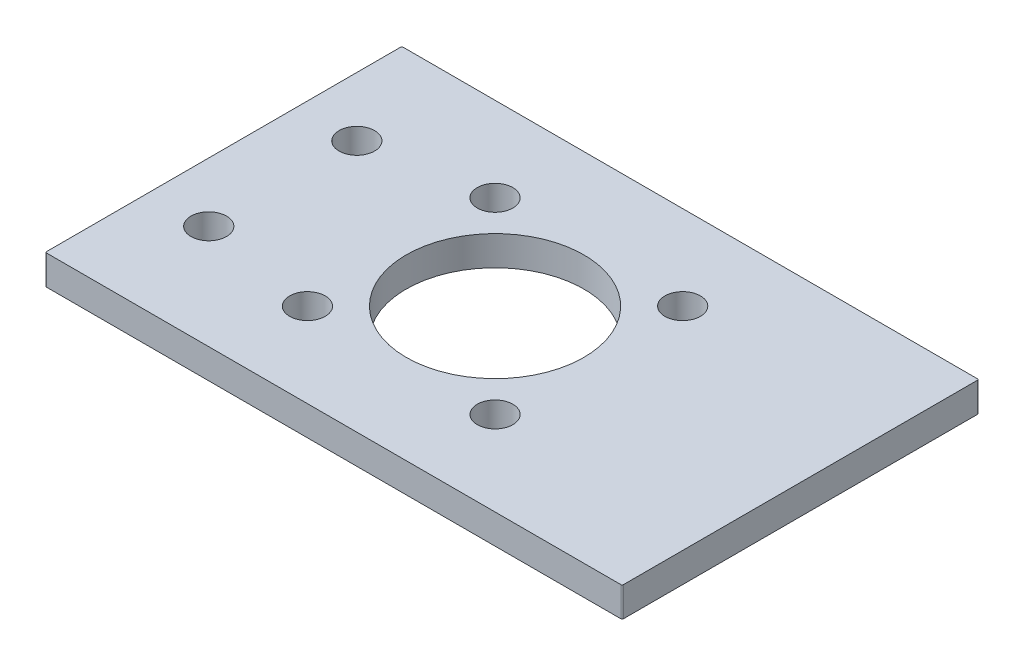
ISO-10303-21;
HEADER;
FILE_DESCRIPTION(('STEP AP214'),'2;1');
FILE_NAME('part.step','',(''),(''),'','','');
FILE_SCHEMA(('AUTOMOTIVE_DESIGN { 1 0 10303 214 1 1 1 1 }'));
ENDSEC;
DATA;
#1=APPLICATION_CONTEXT('core data for automotive mechanical design processes');
#2=APPLICATION_PROTOCOL_DEFINITION('international standard','automotive_design',2000,#1);
#3=PRODUCT_CONTEXT('',#1,'mechanical');
#4=PRODUCT('Part','Part','',(#3));
#5=PRODUCT_RELATED_PRODUCT_CATEGORY('part','',(#4));
#6=PRODUCT_DEFINITION_FORMATION('','',#4);
#7=PRODUCT_DEFINITION_CONTEXT('part definition',#1,'design');
#8=PRODUCT_DEFINITION('design','',#6,#7);
#9=PRODUCT_DEFINITION_SHAPE('','',#8);
#10=(LENGTH_UNIT() NAMED_UNIT(*) SI_UNIT(.MILLI.,.METRE.));
#11=(NAMED_UNIT(*) PLANE_ANGLE_UNIT() SI_UNIT($,.RADIAN.));
#12=(NAMED_UNIT(*) SI_UNIT($,.STERADIAN.) SOLID_ANGLE_UNIT());
#13=UNCERTAINTY_MEASURE_WITH_UNIT(LENGTH_MEASURE(1.E-05),#10,'distance_accuracy_value','');
#14=(GEOMETRIC_REPRESENTATION_CONTEXT(3) GLOBAL_UNCERTAINTY_ASSIGNED_CONTEXT((#13)) GLOBAL_UNIT_ASSIGNED_CONTEXT((#10,
#11,#12)) REPRESENTATION_CONTEXT('',''));
#15=CARTESIAN_POINT('',(0.,0.,0.));
#16=DIRECTION('',(0.,0.,1.));
#17=DIRECTION('',(1.,0.,0.));
#18=AXIS2_PLACEMENT_3D('',#15,#16,#17);
#19=CARTESIAN_POINT('',(61.849,6.35,-38.227));
#20=DIRECTION('',(-1.,0.,0.));
#21=DIRECTION('',(0.,0.,1.));
#22=AXIS2_PLACEMENT_3D('',#19,#20,#21);
#23=PLANE('',#22);
#24=DIRECTION('',(0.,0.,-1.));
#25=VECTOR('',#24,1.);
#26=CARTESIAN_POINT('',(61.849,0.,-38.227));
#27=LINE('',#26,#25);
#28=CARTESIAN_POINT('',(61.849,0.,37.973));
#29=VERTEX_POINT('',#28);
#30=CARTESIAN_POINT('',(61.849,0.,-37.973));
#31=VERTEX_POINT('',#30);
#32=EDGE_CURVE('E141',#29,#31,#27,.T.);
#33=ORIENTED_EDGE('',*,*,#32,.T.);
#34=DIRECTION('',(0.,-1.,0.));
#35=VECTOR('',#34,1.);
#36=CARTESIAN_POINT('',(61.849,6.35,-37.973));
#37=LINE('',#36,#35);
#38=CARTESIAN_POINT('',(61.849,6.35,-37.973));
#39=VERTEX_POINT('',#38);
#40=EDGE_CURVE('E11',#31,#39,#37,.F.);
#41=ORIENTED_EDGE('',*,*,#40,.T.);
#42=DIRECTION('',(0.,0.,-1.));
#43=VECTOR('',#42,1.);
#44=CARTESIAN_POINT('',(61.849,6.35,-38.227));
#45=LINE('',#44,#43);
#46=CARTESIAN_POINT('',(61.849,6.35,37.973));
#47=VERTEX_POINT('',#46);
#48=EDGE_CURVE('E139',#47,#39,#45,.T.);
#49=ORIENTED_EDGE('',*,*,#48,.F.);
#50=DIRECTION('',(0.,-1.,0.));
#51=VECTOR('',#50,1.);
#52=CARTESIAN_POINT('',(61.849,6.35,37.973));
#53=LINE('',#52,#51);
#54=EDGE_CURVE('E48',#47,#29,#53,.T.);
#55=ORIENTED_EDGE('',*,*,#54,.T.);
#56=EDGE_LOOP('',(#33,#41,#49,#55));
#57=FACE_BOUND('',#56,.T.);
#58=ADVANCED_FACE('F39',(#57),#23,.F.);
#59=CARTESIAN_POINT('',(-61.849,6.35,-38.227));
#60=DIRECTION('',(0.,0.,1.));
#61=DIRECTION('',(1.,0.,0.));
#62=AXIS2_PLACEMENT_3D('',#59,#60,#61);
#63=PLANE('',#62);
#64=DIRECTION('',(-1.,0.,0.));
#65=VECTOR('',#64,1.);
#66=CARTESIAN_POINT('',(-61.849,0.,-38.227));
#67=LINE('',#66,#65);
#68=CARTESIAN_POINT('',(61.595,0.,-38.227));
#69=VERTEX_POINT('',#68);
#70=CARTESIAN_POINT('',(-61.595,0.,-38.227));
#71=VERTEX_POINT('',#70);
#72=EDGE_CURVE('E135',#69,#71,#67,.T.);
#73=ORIENTED_EDGE('',*,*,#72,.T.);
#74=DIRECTION('',(0.,-1.,0.));
#75=VECTOR('',#74,1.);
#76=CARTESIAN_POINT('',(-61.595,6.35,-38.227));
#77=LINE('',#76,#75);
#78=CARTESIAN_POINT('',(-61.595,6.35,-38.227));
#79=VERTEX_POINT('',#78);
#80=EDGE_CURVE('E111',#71,#79,#77,.F.);
#81=ORIENTED_EDGE('',*,*,#80,.T.);
#82=DIRECTION('',(-1.,0.,0.));
#83=VECTOR('',#82,1.);
#84=CARTESIAN_POINT('',(-61.849,6.35,-38.227));
#85=LINE('',#84,#83);
#86=CARTESIAN_POINT('',(61.595,6.35,-38.227));
#87=VERTEX_POINT('',#86);
#88=EDGE_CURVE('E198',#87,#79,#85,.T.);
#89=ORIENTED_EDGE('',*,*,#88,.F.);
#90=DIRECTION('',(0.,-1.,0.));
#91=VECTOR('',#90,1.);
#92=CARTESIAN_POINT('',(61.595,6.35,-38.227));
#93=LINE('',#92,#91);
#94=EDGE_CURVE('E117',#87,#69,#93,.T.);
#95=ORIENTED_EDGE('',*,*,#94,.T.);
#96=EDGE_LOOP('',(#73,#81,#89,#95));
#97=FACE_BOUND('',#96,.T.);
#98=ADVANCED_FACE('F277',(#97),#63,.F.);
#99=CARTESIAN_POINT('',(-61.849,6.35,38.227));
#100=DIRECTION('',(1.,0.,0.));
#101=DIRECTION('',(0.,0.,-1.));
#102=AXIS2_PLACEMENT_3D('',#99,#100,#101);
#103=PLANE('',#102);
#104=DIRECTION('',(0.,0.,1.));
#105=VECTOR('',#104,1.);
#106=CARTESIAN_POINT('',(-61.849,6.35,38.227));
#107=LINE('',#106,#105);
#108=CARTESIAN_POINT('',(-61.849,6.35,-37.973));
#109=VERTEX_POINT('',#108);
#110=CARTESIAN_POINT('',(-61.849,6.35,37.973));
#111=VERTEX_POINT('',#110);
#112=EDGE_CURVE('E126',#109,#111,#107,.T.);
#113=ORIENTED_EDGE('',*,*,#112,.F.);
#114=DIRECTION('',(0.,-1.,0.));
#115=VECTOR('',#114,1.);
#116=CARTESIAN_POINT('',(-61.849,6.35,-37.973));
#117=LINE('',#116,#115);
#118=CARTESIAN_POINT('',(-61.849,0.,-37.973));
#119=VERTEX_POINT('',#118);
#120=EDGE_CURVE('E110',#109,#119,#117,.T.);
#121=ORIENTED_EDGE('',*,*,#120,.T.);
#122=DIRECTION('',(0.,0.,1.));
#123=VECTOR('',#122,1.);
#124=CARTESIAN_POINT('',(-61.849,0.,38.227));
#125=LINE('',#124,#123);
#126=CARTESIAN_POINT('',(-61.849,0.,37.973));
#127=VERTEX_POINT('',#126);
#128=EDGE_CURVE('E124',#119,#127,#125,.T.);
#129=ORIENTED_EDGE('',*,*,#128,.T.);
#130=DIRECTION('',(0.,-1.,0.));
#131=VECTOR('',#130,1.);
#132=CARTESIAN_POINT('',(-61.849,6.35,37.973));
#133=LINE('',#132,#131);
#134=EDGE_CURVE('E129',#127,#111,#133,.F.);
#135=ORIENTED_EDGE('',*,*,#134,.T.);
#136=EDGE_LOOP('',(#113,#121,#129,#135));
#137=FACE_BOUND('',#136,.T.);
#138=ADVANCED_FACE('F123',(#137),#103,.F.);
#139=CARTESIAN_POINT('',(61.849,6.35,38.227));
#140=DIRECTION('',(0.,0.,-1.));
#141=DIRECTION('',(-1.,0.,0.));
#142=AXIS2_PLACEMENT_3D('',#139,#140,#141);
#143=PLANE('',#142);
#144=DIRECTION('',(1.,0.,0.));
#145=VECTOR('',#144,1.);
#146=CARTESIAN_POINT('',(61.849,6.35,38.227));
#147=LINE('',#146,#145);
#148=CARTESIAN_POINT('',(-61.595,6.35,38.227));
#149=VERTEX_POINT('',#148);
#150=CARTESIAN_POINT('',(61.595,6.35,38.227));
#151=VERTEX_POINT('',#150);
#152=EDGE_CURVE('E146',#149,#151,#147,.T.);
#153=ORIENTED_EDGE('',*,*,#152,.F.);
#154=DIRECTION('',(0.,-1.,0.));
#155=VECTOR('',#154,1.);
#156=CARTESIAN_POINT('',(-61.595,6.35,38.227));
#157=LINE('',#156,#155);
#158=CARTESIAN_POINT('',(-61.595,0.,38.227));
#159=VERTEX_POINT('',#158);
#160=EDGE_CURVE('E173',#149,#159,#157,.T.);
#161=ORIENTED_EDGE('',*,*,#160,.T.);
#162=DIRECTION('',(1.,0.,0.));
#163=VECTOR('',#162,1.);
#164=CARTESIAN_POINT('',(61.849,0.,38.227));
#165=LINE('',#164,#163);
#166=CARTESIAN_POINT('',(61.595,0.,38.227));
#167=VERTEX_POINT('',#166);
#168=EDGE_CURVE('E134',#159,#167,#165,.T.);
#169=ORIENTED_EDGE('',*,*,#168,.T.);
#170=DIRECTION('',(0.,-1.,0.));
#171=VECTOR('',#170,1.);
#172=CARTESIAN_POINT('',(61.595,6.35,38.227));
#173=LINE('',#172,#171);
#174=EDGE_CURVE('E55',#167,#151,#173,.F.);
#175=ORIENTED_EDGE('',*,*,#174,.T.);
#176=EDGE_LOOP('',(#153,#161,#169,#175));
#177=FACE_BOUND('',#176,.T.);
#178=ADVANCED_FACE('F269',(#177),#143,.F.);
#179=CARTESIAN_POINT('',(0.,6.35,0.));
#180=DIRECTION('',(0.,-1.,0.));
#181=DIRECTION('',(0.,0.,-1.));
#182=AXIS2_PLACEMENT_3D('',#179,#180,#181);
#183=PLANE('',#182);
#184=CARTESIAN_POINT('',(-49.149,6.35,15.875));
#185=DIRECTION('',(0.,1.,0.));
#186=DIRECTION('',(0.,0.,1.));
#187=AXIS2_PLACEMENT_3D('',#184,#185,#186);
#188=CIRCLE('',#187,3.81);
#189=CARTESIAN_POINT('',(-49.149,6.35,19.685));
#190=VERTEX_POINT('',#189);
#191=EDGE_CURVE('E208',#190,#190,#188,.T.);
#192=ORIENTED_EDGE('',*,*,#191,.F.);
#193=EDGE_LOOP('',(#192));
#194=FACE_BOUND('',#193,.T.);
#195=CARTESIAN_POINT('',(-49.149,6.35,-15.875));
#196=DIRECTION('',(0.,1.,0.));
#197=DIRECTION('',(0.,0.,1.));
#198=AXIS2_PLACEMENT_3D('',#195,#196,#197);
#199=CIRCLE('',#198,3.81);
#200=CARTESIAN_POINT('',(-49.149,6.35,-12.065));
#201=VERTEX_POINT('',#200);
#202=EDGE_CURVE('E216',#201,#201,#199,.T.);
#203=ORIENTED_EDGE('',*,*,#202,.F.);
#204=EDGE_LOOP('',(#203));
#205=FACE_BOUND('',#204,.T.);
#206=CARTESIAN_POINT('',(16.4825474223966,6.35,20.1157737111949));
#207=DIRECTION('',(0.,1.,0.));
#208=DIRECTION('',(0.,0.,1.));
#209=AXIS2_PLACEMENT_3D('',#206,#207,#208);
#210=CIRCLE('',#209,3.81);
#211=CARTESIAN_POINT('',(16.4825474223966,6.35,23.9257737111949));
#212=VERTEX_POINT('',#211);
#213=EDGE_CURVE('E224',#212,#212,#210,.T.);
#214=ORIENTED_EDGE('',*,*,#213,.F.);
#215=EDGE_LOOP('',(#214));
#216=FACE_BOUND('',#215,.T.);
#217=CARTESIAN_POINT('',(-23.749,6.35,20.1157737111949));
#218=DIRECTION('',(0.,1.,0.));
#219=DIRECTION('',(0.,0.,1.));
#220=AXIS2_PLACEMENT_3D('',#217,#218,#219);
#221=CIRCLE('',#220,3.81);
#222=CARTESIAN_POINT('',(-23.749,6.35,23.9257737111949));
#223=VERTEX_POINT('',#222);
#224=EDGE_CURVE('E232',#223,#223,#221,.T.);
#225=ORIENTED_EDGE('',*,*,#224,.F.);
#226=EDGE_LOOP('',(#225));
#227=FACE_BOUND('',#226,.T.);
#228=CARTESIAN_POINT('',(-23.749,6.35,-20.1157737111955));
#229=DIRECTION('',(0.,1.,0.));
#230=DIRECTION('',(0.,0.,1.));
#231=AXIS2_PLACEMENT_3D('',#228,#229,#230);
#232=CIRCLE('',#231,3.81);
#233=CARTESIAN_POINT('',(-23.749,6.35,-16.3057737111955));
#234=VERTEX_POINT('',#233);
#235=EDGE_CURVE('E240',#234,#234,#232,.T.);
#236=ORIENTED_EDGE('',*,*,#235,.F.);
#237=EDGE_LOOP('',(#236));
#238=FACE_BOUND('',#237,.T.);
#239=CARTESIAN_POINT('',(16.4825474223966,6.35,-20.1157737111955));
#240=DIRECTION('',(0.,1.,0.));
#241=DIRECTION('',(0.,0.,1.));
#242=AXIS2_PLACEMENT_3D('',#239,#240,#241);
#243=CIRCLE('',#242,3.81);
#244=CARTESIAN_POINT('',(16.4825474223966,6.35,-16.3057737111955));
#245=VERTEX_POINT('',#244);
#246=EDGE_CURVE('E248',#245,#245,#243,.T.);
#247=ORIENTED_EDGE('',*,*,#246,.F.);
#248=EDGE_LOOP('',(#247));
#249=FACE_BOUND('',#248,.T.);
#250=CARTESIAN_POINT('',(-3.63322628879788,6.35,0.));
#251=DIRECTION('',(0.,1.,0.));
#252=DIRECTION('',(0.,0.,1.));
#253=AXIS2_PLACEMENT_3D('',#250,#251,#252);
#254=CIRCLE('',#253,19.05);
#255=CARTESIAN_POINT('',(-3.63322628879788,6.35,19.05));
#256=VERTEX_POINT('',#255);
#257=EDGE_CURVE('E191',#256,#256,#254,.T.);
#258=ORIENTED_EDGE('',*,*,#257,.F.);
#259=EDGE_LOOP('',(#258));
#260=FACE_BOUND('',#259,.T.);
#261=ORIENTED_EDGE('',*,*,#88,.T.);
#262=CARTESIAN_POINT('',(-61.595,6.35,-37.973));
#263=DIRECTION('',(0.,-1.,0.));
#264=DIRECTION('',(0.,0.,-1.));
#265=AXIS2_PLACEMENT_3D('',#262,#263,#264);
#266=CIRCLE('',#265,0.254);
#267=EDGE_CURVE('E168',#79,#109,#266,.F.);
#268=ORIENTED_EDGE('',*,*,#267,.T.);
#269=ORIENTED_EDGE('',*,*,#112,.T.);
#270=CARTESIAN_POINT('',(-61.595,6.35,37.973));
#271=DIRECTION('',(0.,-1.,0.));
#272=DIRECTION('',(0.,0.,-1.));
#273=AXIS2_PLACEMENT_3D('',#270,#271,#272);
#274=CIRCLE('',#273,0.254);
#275=EDGE_CURVE('E62',#111,#149,#274,.F.);
#276=ORIENTED_EDGE('',*,*,#275,.T.);
#277=ORIENTED_EDGE('',*,*,#152,.T.);
#278=CARTESIAN_POINT('',(61.595,6.35,37.973));
#279=DIRECTION('',(0.,-1.,0.));
#280=DIRECTION('',(0.,0.,-1.));
#281=AXIS2_PLACEMENT_3D('',#278,#279,#280);
#282=CIRCLE('',#281,0.254);
#283=EDGE_CURVE('E160',#151,#47,#282,.F.);
#284=ORIENTED_EDGE('',*,*,#283,.T.);
#285=ORIENTED_EDGE('',*,*,#48,.T.);
#286=CARTESIAN_POINT('',(61.595,6.35,-37.973));
#287=DIRECTION('',(0.,-1.,0.));
#288=DIRECTION('',(0.,0.,-1.));
#289=AXIS2_PLACEMENT_3D('',#286,#287,#288);
#290=CIRCLE('',#289,0.254);
#291=EDGE_CURVE('E163',#39,#87,#290,.F.);
#292=ORIENTED_EDGE('',*,*,#291,.T.);
#293=EDGE_LOOP('',(#261,#268,#269,#276,#277,#284,#285,#292));
#294=FACE_BOUND('',#293,.T.);
#295=ADVANCED_FACE('F266',(#194,#205,#216,#227,#238,#249,#260,#294),#183,.F.);
#296=CARTESIAN_POINT('',(0.,0.,0.));
#297=DIRECTION('',(0.,-1.,0.));
#298=DIRECTION('',(0.,0.,-1.));
#299=AXIS2_PLACEMENT_3D('',#296,#297,#298);
#300=PLANE('',#299);
#301=CARTESIAN_POINT('',(-49.149,0.,15.875));
#302=DIRECTION('',(0.,1.,0.));
#303=DIRECTION('',(0.,0.,1.));
#304=AXIS2_PLACEMENT_3D('',#301,#302,#303);
#305=CIRCLE('',#304,3.81);
#306=CARTESIAN_POINT('',(-49.149,0.,19.685));
#307=VERTEX_POINT('',#306);
#308=EDGE_CURVE('E212',#307,#307,#305,.T.);
#309=ORIENTED_EDGE('',*,*,#308,.T.);
#310=EDGE_LOOP('',(#309));
#311=FACE_BOUND('',#310,.T.);
#312=CARTESIAN_POINT('',(-49.149,0.,-15.875));
#313=DIRECTION('',(0.,1.,0.));
#314=DIRECTION('',(0.,0.,1.));
#315=AXIS2_PLACEMENT_3D('',#312,#313,#314);
#316=CIRCLE('',#315,3.81);
#317=CARTESIAN_POINT('',(-49.149,0.,-12.065));
#318=VERTEX_POINT('',#317);
#319=EDGE_CURVE('E220',#318,#318,#316,.T.);
#320=ORIENTED_EDGE('',*,*,#319,.T.);
#321=EDGE_LOOP('',(#320));
#322=FACE_BOUND('',#321,.T.);
#323=CARTESIAN_POINT('',(16.4825474223966,0.,20.1157737111949));
#324=DIRECTION('',(0.,1.,0.));
#325=DIRECTION('',(0.,0.,1.));
#326=AXIS2_PLACEMENT_3D('',#323,#324,#325);
#327=CIRCLE('',#326,3.81);
#328=CARTESIAN_POINT('',(16.4825474223966,0.,23.9257737111949));
#329=VERTEX_POINT('',#328);
#330=EDGE_CURVE('E228',#329,#329,#327,.T.);
#331=ORIENTED_EDGE('',*,*,#330,.T.);
#332=EDGE_LOOP('',(#331));
#333=FACE_BOUND('',#332,.T.);
#334=CARTESIAN_POINT('',(-23.749,0.,20.1157737111949));
#335=DIRECTION('',(0.,1.,0.));
#336=DIRECTION('',(0.,0.,1.));
#337=AXIS2_PLACEMENT_3D('',#334,#335,#336);
#338=CIRCLE('',#337,3.81);
#339=CARTESIAN_POINT('',(-23.749,0.,23.9257737111949));
#340=VERTEX_POINT('',#339);
#341=EDGE_CURVE('E236',#340,#340,#338,.T.);
#342=ORIENTED_EDGE('',*,*,#341,.T.);
#343=EDGE_LOOP('',(#342));
#344=FACE_BOUND('',#343,.T.);
#345=CARTESIAN_POINT('',(-23.749,0.,-20.1157737111955));
#346=DIRECTION('',(0.,1.,0.));
#347=DIRECTION('',(0.,0.,1.));
#348=AXIS2_PLACEMENT_3D('',#345,#346,#347);
#349=CIRCLE('',#348,3.81);
#350=CARTESIAN_POINT('',(-23.749,0.,-16.3057737111955));
#351=VERTEX_POINT('',#350);
#352=EDGE_CURVE('E244',#351,#351,#349,.T.);
#353=ORIENTED_EDGE('',*,*,#352,.T.);
#354=EDGE_LOOP('',(#353));
#355=FACE_BOUND('',#354,.T.);
#356=CARTESIAN_POINT('',(16.4825474223966,0.,-20.1157737111955));
#357=DIRECTION('',(0.,1.,0.));
#358=DIRECTION('',(0.,0.,1.));
#359=AXIS2_PLACEMENT_3D('',#356,#357,#358);
#360=CIRCLE('',#359,3.81);
#361=CARTESIAN_POINT('',(16.4825474223966,0.,-16.3057737111955));
#362=VERTEX_POINT('',#361);
#363=EDGE_CURVE('E206',#362,#362,#360,.T.);
#364=ORIENTED_EDGE('',*,*,#363,.T.);
#365=EDGE_LOOP('',(#364));
#366=FACE_BOUND('',#365,.T.);
#367=CARTESIAN_POINT('',(-3.63322628879788,0.,0.));
#368=DIRECTION('',(0.,1.,0.));
#369=DIRECTION('',(0.,0.,1.));
#370=AXIS2_PLACEMENT_3D('',#367,#368,#369);
#371=CIRCLE('',#370,19.05);
#372=CARTESIAN_POINT('',(-3.63322628879788,0.,19.05));
#373=VERTEX_POINT('',#372);
#374=EDGE_CURVE('E188',#373,#373,#371,.T.);
#375=ORIENTED_EDGE('',*,*,#374,.T.);
#376=EDGE_LOOP('',(#375));
#377=FACE_BOUND('',#376,.T.);
#378=ORIENTED_EDGE('',*,*,#128,.F.);
#379=CARTESIAN_POINT('',(-61.595,0.,-37.973));
#380=DIRECTION('',(0.,-1.,0.));
#381=DIRECTION('',(0.,0.,-1.));
#382=AXIS2_PLACEMENT_3D('',#379,#380,#381);
#383=CIRCLE('',#382,0.254);
#384=EDGE_CURVE('E106',#119,#71,#383,.T.);
#385=ORIENTED_EDGE('',*,*,#384,.T.);
#386=ORIENTED_EDGE('',*,*,#72,.F.);
#387=CARTESIAN_POINT('',(61.595,0.,-37.973));
#388=DIRECTION('',(0.,-1.,0.));
#389=DIRECTION('',(0.,0.,-1.));
#390=AXIS2_PLACEMENT_3D('',#387,#388,#389);
#391=CIRCLE('',#390,0.254);
#392=EDGE_CURVE('E150',#69,#31,#391,.T.);
#393=ORIENTED_EDGE('',*,*,#392,.T.);
#394=ORIENTED_EDGE('',*,*,#32,.F.);
#395=CARTESIAN_POINT('',(61.595,0.,37.973));
#396=DIRECTION('',(0.,-1.,0.));
#397=DIRECTION('',(0.,0.,-1.));
#398=AXIS2_PLACEMENT_3D('',#395,#396,#397);
#399=CIRCLE('',#398,0.254);
#400=EDGE_CURVE('E128',#29,#167,#399,.T.);
#401=ORIENTED_EDGE('',*,*,#400,.T.);
#402=ORIENTED_EDGE('',*,*,#168,.F.);
#403=CARTESIAN_POINT('',(-61.595,0.,37.973));
#404=DIRECTION('',(0.,-1.,0.));
#405=DIRECTION('',(0.,0.,-1.));
#406=AXIS2_PLACEMENT_3D('',#403,#404,#405);
#407=CIRCLE('',#406,0.254);
#408=EDGE_CURVE('E118',#159,#127,#407,.T.);
#409=ORIENTED_EDGE('',*,*,#408,.T.);
#410=EDGE_LOOP('',(#378,#385,#386,#393,#394,#401,#402,#409));
#411=FACE_BOUND('',#410,.T.);
#412=ADVANCED_FACE('F131',(#311,#322,#333,#344,#355,#366,#377,#411),#300,.T.);
#413=CARTESIAN_POINT('',(-3.63322628879788,0.,0.));
#414=DIRECTION('',(0.,1.,0.));
#415=DIRECTION('',(0.,0.,1.));
#416=AXIS2_PLACEMENT_3D('',#413,#414,#415);
#417=CYLINDRICAL_SURFACE('',#416,19.05);
#418=ORIENTED_EDGE('',*,*,#374,.F.);
#419=EDGE_LOOP('',(#418));
#420=FACE_BOUND('',#419,.T.);
#421=ORIENTED_EDGE('',*,*,#257,.T.);
#422=EDGE_LOOP('',(#421));
#423=FACE_BOUND('',#422,.T.);
#424=ADVANCED_FACE('F262',(#420,#423),#417,.F.);
#425=CARTESIAN_POINT('',(16.4825474223966,0.,-20.1157737111955));
#426=DIRECTION('',(0.,1.,0.));
#427=DIRECTION('',(0.,0.,1.));
#428=AXIS2_PLACEMENT_3D('',#425,#426,#427);
#429=CYLINDRICAL_SURFACE('',#428,3.81);
#430=ORIENTED_EDGE('',*,*,#363,.F.);
#431=EDGE_LOOP('',(#430));
#432=FACE_BOUND('',#431,.T.);
#433=ORIENTED_EDGE('',*,*,#246,.T.);
#434=EDGE_LOOP('',(#433));
#435=FACE_BOUND('',#434,.T.);
#436=ADVANCED_FACE('F258',(#432,#435),#429,.F.);
#437=CARTESIAN_POINT('',(-23.749,0.,-20.1157737111955));
#438=DIRECTION('',(0.,1.,0.));
#439=DIRECTION('',(0.,0.,1.));
#440=AXIS2_PLACEMENT_3D('',#437,#438,#439);
#441=CYLINDRICAL_SURFACE('',#440,3.81);
#442=ORIENTED_EDGE('',*,*,#352,.F.);
#443=EDGE_LOOP('',(#442));
#444=FACE_BOUND('',#443,.T.);
#445=ORIENTED_EDGE('',*,*,#235,.T.);
#446=EDGE_LOOP('',(#445));
#447=FACE_BOUND('',#446,.T.);
#448=ADVANCED_FACE('F261',(#444,#447),#441,.F.);
#449=CARTESIAN_POINT('',(-23.749,0.,20.1157737111949));
#450=DIRECTION('',(0.,1.,0.));
#451=DIRECTION('',(0.,0.,1.));
#452=AXIS2_PLACEMENT_3D('',#449,#450,#451);
#453=CYLINDRICAL_SURFACE('',#452,3.81);
#454=ORIENTED_EDGE('',*,*,#341,.F.);
#455=EDGE_LOOP('',(#454));
#456=FACE_BOUND('',#455,.T.);
#457=ORIENTED_EDGE('',*,*,#224,.T.);
#458=EDGE_LOOP('',(#457));
#459=FACE_BOUND('',#458,.T.);
#460=ADVANCED_FACE('F323',(#456,#459),#453,.F.);
#461=CARTESIAN_POINT('',(16.4825474223966,0.,20.1157737111949));
#462=DIRECTION('',(0.,1.,0.));
#463=DIRECTION('',(0.,0.,1.));
#464=AXIS2_PLACEMENT_3D('',#461,#462,#463);
#465=CYLINDRICAL_SURFACE('',#464,3.81);
#466=ORIENTED_EDGE('',*,*,#330,.F.);
#467=EDGE_LOOP('',(#466));
#468=FACE_BOUND('',#467,.T.);
#469=ORIENTED_EDGE('',*,*,#213,.T.);
#470=EDGE_LOOP('',(#469));
#471=FACE_BOUND('',#470,.T.);
#472=ADVANCED_FACE('F319',(#468,#471),#465,.F.);
#473=CARTESIAN_POINT('',(-49.149,0.,-15.875));
#474=DIRECTION('',(0.,1.,0.));
#475=DIRECTION('',(0.,0.,1.));
#476=AXIS2_PLACEMENT_3D('',#473,#474,#475);
#477=CYLINDRICAL_SURFACE('',#476,3.81);
#478=ORIENTED_EDGE('',*,*,#319,.F.);
#479=EDGE_LOOP('',(#478));
#480=FACE_BOUND('',#479,.T.);
#481=ORIENTED_EDGE('',*,*,#202,.T.);
#482=EDGE_LOOP('',(#481));
#483=FACE_BOUND('',#482,.T.);
#484=ADVANCED_FACE('F315',(#480,#483),#477,.F.);
#485=CARTESIAN_POINT('',(-49.149,0.,15.875));
#486=DIRECTION('',(0.,1.,0.));
#487=DIRECTION('',(0.,0.,1.));
#488=AXIS2_PLACEMENT_3D('',#485,#486,#487);
#489=CYLINDRICAL_SURFACE('',#488,3.81);
#490=ORIENTED_EDGE('',*,*,#308,.F.);
#491=EDGE_LOOP('',(#490));
#492=FACE_BOUND('',#491,.T.);
#493=ORIENTED_EDGE('',*,*,#191,.T.);
#494=EDGE_LOOP('',(#493));
#495=FACE_BOUND('',#494,.T.);
#496=ADVANCED_FACE('F295',(#492,#495),#489,.F.);
#497=CARTESIAN_POINT('',(-61.595,6.35,-37.973));
#498=DIRECTION('',(0.,-1.,0.));
#499=DIRECTION('',(0.,0.,-1.));
#500=AXIS2_PLACEMENT_3D('',#497,#498,#499);
#501=CYLINDRICAL_SURFACE('',#500,0.254);
#502=ORIENTED_EDGE('',*,*,#267,.F.);
#503=ORIENTED_EDGE('',*,*,#80,.F.);
#504=ORIENTED_EDGE('',*,*,#384,.F.);
#505=ORIENTED_EDGE('',*,*,#120,.F.);
#506=EDGE_LOOP('',(#502,#503,#504,#505));
#507=FACE_BOUND('',#506,.T.);
#508=ADVANCED_FACE('F109',(#507),#501,.T.);
#509=CARTESIAN_POINT('',(-61.595,6.35,37.973));
#510=DIRECTION('',(0.,-1.,0.));
#511=DIRECTION('',(0.,0.,-1.));
#512=AXIS2_PLACEMENT_3D('',#509,#510,#511);
#513=CYLINDRICAL_SURFACE('',#512,0.254);
#514=ORIENTED_EDGE('',*,*,#275,.F.);
#515=ORIENTED_EDGE('',*,*,#134,.F.);
#516=ORIENTED_EDGE('',*,*,#408,.F.);
#517=ORIENTED_EDGE('',*,*,#160,.F.);
#518=EDGE_LOOP('',(#514,#515,#516,#517));
#519=FACE_BOUND('',#518,.T.);
#520=ADVANCED_FACE('F284',(#519),#513,.T.);
#521=CARTESIAN_POINT('',(61.595,6.35,-37.973));
#522=DIRECTION('',(0.,-1.,0.));
#523=DIRECTION('',(0.,0.,-1.));
#524=AXIS2_PLACEMENT_3D('',#521,#522,#523);
#525=CYLINDRICAL_SURFACE('',#524,0.254);
#526=ORIENTED_EDGE('',*,*,#291,.F.);
#527=ORIENTED_EDGE('',*,*,#40,.F.);
#528=ORIENTED_EDGE('',*,*,#392,.F.);
#529=ORIENTED_EDGE('',*,*,#94,.F.);
#530=EDGE_LOOP('',(#526,#527,#528,#529));
#531=FACE_BOUND('',#530,.T.);
#532=ADVANCED_FACE('F279',(#531),#525,.T.);
#533=CARTESIAN_POINT('',(61.595,6.35,37.973));
#534=DIRECTION('',(0.,-1.,0.));
#535=DIRECTION('',(0.,0.,-1.));
#536=AXIS2_PLACEMENT_3D('',#533,#534,#535);
#537=CYLINDRICAL_SURFACE('',#536,0.254);
#538=ORIENTED_EDGE('',*,*,#283,.F.);
#539=ORIENTED_EDGE('',*,*,#174,.F.);
#540=ORIENTED_EDGE('',*,*,#400,.F.);
#541=ORIENTED_EDGE('',*,*,#54,.F.);
#542=EDGE_LOOP('',(#538,#539,#540,#541));
#543=FACE_BOUND('',#542,.T.);
#544=ADVANCED_FACE('F41',(#543),#537,.T.);
#545=CLOSED_SHELL('',(#58,#98,#138,#178,#295,#412,#424,#436,#448,#460,#472,#484,#496,#508,#520,
#532,#544));
#546=MANIFOLD_SOLID_BREP('B2',#545);
#547=ADVANCED_BREP_SHAPE_REPRESENTATION('',(#18,#546),#14);
#548=SHAPE_DEFINITION_REPRESENTATION(#9,#547);
ENDSEC;
END-ISO-10303-21;
